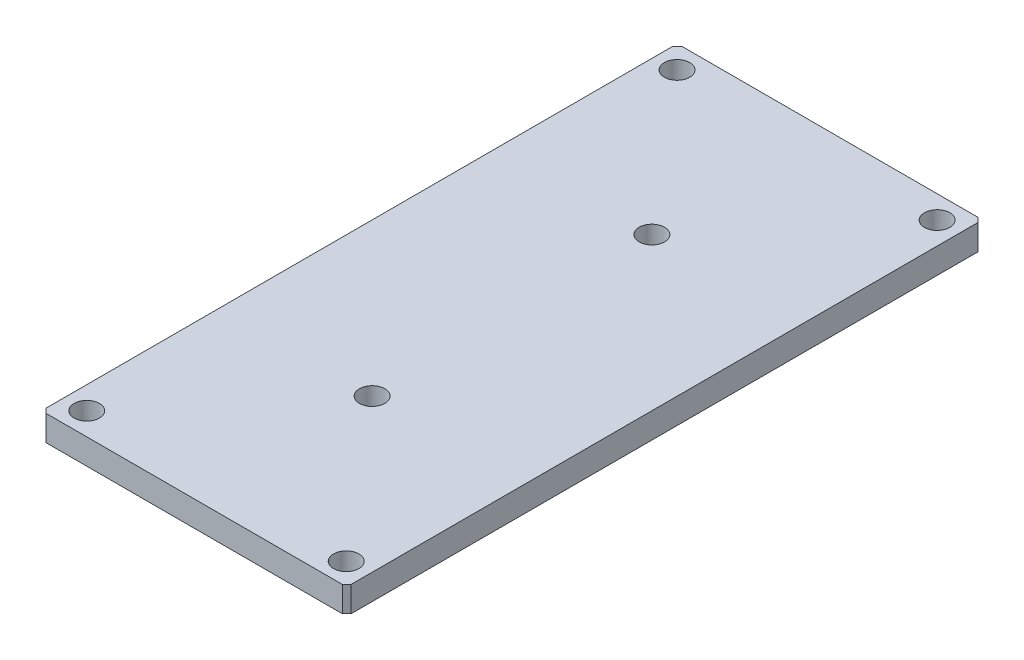
ISO-10303-21;
HEADER;
FILE_DESCRIPTION(('STEP AP214'),'2;1');
FILE_NAME('part.step','',(''),(''),'','','');
FILE_SCHEMA(('AUTOMOTIVE_DESIGN { 1 0 10303 214 1 1 1 1 }'));
ENDSEC;
DATA;
#1=APPLICATION_CONTEXT('core data for automotive mechanical design processes');
#2=APPLICATION_PROTOCOL_DEFINITION('international standard','automotive_design',2000,#1);
#3=PRODUCT_CONTEXT('',#1,'mechanical');
#4=PRODUCT('Part','Part','',(#3));
#5=PRODUCT_RELATED_PRODUCT_CATEGORY('part','',(#4));
#6=PRODUCT_DEFINITION_FORMATION('','',#4);
#7=PRODUCT_DEFINITION_CONTEXT('part definition',#1,'design');
#8=PRODUCT_DEFINITION('design','',#6,#7);
#9=PRODUCT_DEFINITION_SHAPE('','',#8);
#10=(LENGTH_UNIT() NAMED_UNIT(*) SI_UNIT(.MILLI.,.METRE.));
#11=(NAMED_UNIT(*) PLANE_ANGLE_UNIT() SI_UNIT($,.RADIAN.));
#12=(NAMED_UNIT(*) SI_UNIT($,.STERADIAN.) SOLID_ANGLE_UNIT());
#13=UNCERTAINTY_MEASURE_WITH_UNIT(LENGTH_MEASURE(1.E-05),#10,'distance_accuracy_value','');
#14=(GEOMETRIC_REPRESENTATION_CONTEXT(3) GLOBAL_UNCERTAINTY_ASSIGNED_CONTEXT((#13)) GLOBAL_UNIT_ASSIGNED_CONTEXT((#10,
#11,#12)) REPRESENTATION_CONTEXT('',''));
#15=CARTESIAN_POINT('',(0.,0.,0.));
#16=DIRECTION('',(0.,0.,1.));
#17=DIRECTION('',(1.,0.,0.));
#18=AXIS2_PLACEMENT_3D('',#15,#16,#17);
#19=CARTESIAN_POINT('',(0.,2.,0.));
#20=DIRECTION('',(0.,1.,0.));
#21=DIRECTION('',(0.,0.,1.));
#22=AXIS2_PLACEMENT_3D('',#19,#20,#21);
#23=PLANE('',#22);
#24=DIRECTION('',(-0.707106781186537,0.,-0.707106781186558));
#25=VECTOR('',#24,1.);
#26=CARTESIAN_POINT('',(-23.8858439569682,2.,-24.5586256320623));
#27=LINE('',#26,#25);
#28=CARTESIAN_POINT('',(-23.5358439569682,2.,-24.2086256320623));
#29=VERTEX_POINT('',#28);
#30=CARTESIAN_POINT('',(-23.8858439569682,2.,-24.5586256320623));
#31=VERTEX_POINT('',#30);
#32=EDGE_CURVE('E163',#29,#31,#27,.T.);
#33=ORIENTED_EDGE('',*,*,#32,.F.);
#34=DIRECTION('',(1.,0.,0.));
#35=VECTOR('',#34,1.);
#36=CARTESIAN_POINT('',(0.114156043031811,2.,-24.2086256320623));
#37=LINE('',#36,#35);
#38=CARTESIAN_POINT('',(-0.235843956968188,2.,-24.2086256320623));
#39=VERTEX_POINT('',#38);
#40=EDGE_CURVE('E11',#29,#39,#37,.T.);
#41=ORIENTED_EDGE('',*,*,#40,.T.);
#42=DIRECTION('',(-0.707106781186548,0.,0.707106781186547));
#43=VECTOR('',#42,1.);
#44=CARTESIAN_POINT('',(0.114156043031811,2.,-24.5586256320623));
#45=LINE('',#44,#43);
#46=CARTESIAN_POINT('',(0.114156043031811,2.,-24.5586256320623));
#47=VERTEX_POINT('',#46);
#48=EDGE_CURVE('E108',#47,#39,#45,.T.);
#49=ORIENTED_EDGE('',*,*,#48,.F.);
#50=DIRECTION('',(0.,0.,-1.));
#51=VECTOR('',#50,1.);
#52=CARTESIAN_POINT('',(0.114156043031811,2.,-24.2086256320623));
#53=LINE('',#52,#51);
#54=CARTESIAN_POINT('',(0.114156043031811,2.,-73.8586256320623));
#55=VERTEX_POINT('',#54);
#56=EDGE_CURVE('E123',#47,#55,#53,.T.);
#57=ORIENTED_EDGE('',*,*,#56,.T.);
#58=DIRECTION('',(0.707106781186544,0.,0.707106781186551));
#59=VECTOR('',#58,1.);
#60=CARTESIAN_POINT('',(-0.235843956968189,2.,-74.2086256320623));
#61=LINE('',#60,#59);
#62=CARTESIAN_POINT('',(-0.235843956968189,2.,-74.2086256320623));
#63=VERTEX_POINT('',#62);
#64=EDGE_CURVE('E243',#63,#55,#61,.T.);
#65=ORIENTED_EDGE('',*,*,#64,.F.);
#66=DIRECTION('',(-1.,0.,0.));
#67=VECTOR('',#66,1.);
#68=CARTESIAN_POINT('',(0.114156043031811,2.,-74.2086256320623));
#69=LINE('',#68,#67);
#70=CARTESIAN_POINT('',(-23.5358439569682,2.,-74.2086256320623));
#71=VERTEX_POINT('',#70);
#72=EDGE_CURVE('E129',#63,#71,#69,.T.);
#73=ORIENTED_EDGE('',*,*,#72,.T.);
#74=DIRECTION('',(0.707106781186544,0.,-0.707106781186551));
#75=VECTOR('',#74,1.);
#76=CARTESIAN_POINT('',(-23.8858439569682,2.,-73.8586256320623));
#77=LINE('',#76,#75);
#78=CARTESIAN_POINT('',(-23.8858439569682,2.,-73.8586256320623));
#79=VERTEX_POINT('',#78);
#80=EDGE_CURVE('E125',#79,#71,#77,.T.);
#81=ORIENTED_EDGE('',*,*,#80,.F.);
#82=DIRECTION('',(0.,0.,1.));
#83=VECTOR('',#82,1.);
#84=CARTESIAN_POINT('',(-23.8858439569682,2.,-24.2086256320623));
#85=LINE('',#84,#83);
#86=EDGE_CURVE('E48',#79,#31,#85,.T.);
#87=ORIENTED_EDGE('',*,*,#86,.T.);
#88=EDGE_LOOP('',(#33,#41,#49,#57,#65,#73,#81,#87));
#89=FACE_BOUND('',#88,.T.);
#90=CARTESIAN_POINT('',(-1.65584395696819,2.,-25.9386256320623));
#91=DIRECTION('',(0.,1.,0.));
#92=DIRECTION('',(0.,0.,1.));
#93=AXIS2_PLACEMENT_3D('',#90,#91,#92);
#94=CIRCLE('',#93,1.);
#95=CARTESIAN_POINT('',(-1.65584395696819,2.,-24.9386256320623));
#96=VERTEX_POINT('',#95);
#97=EDGE_CURVE('E196',#96,#96,#94,.T.);
#98=ORIENTED_EDGE('',*,*,#97,.F.);
#99=EDGE_LOOP('',(#98));
#100=FACE_BOUND('',#99,.T.);
#101=CARTESIAN_POINT('',(-22.1078439569682,2.,-25.9866256320623));
#102=DIRECTION('',(0.,1.,0.));
#103=DIRECTION('',(0.,0.,1.));
#104=AXIS2_PLACEMENT_3D('',#101,#102,#103);
#105=CIRCLE('',#104,1.);
#106=CARTESIAN_POINT('',(-22.1078439569682,2.,-24.9866256320623));
#107=VERTEX_POINT('',#106);
#108=EDGE_CURVE('E190',#107,#107,#105,.T.);
#109=ORIENTED_EDGE('',*,*,#108,.F.);
#110=EDGE_LOOP('',(#109));
#111=FACE_BOUND('',#110,.T.);
#112=CARTESIAN_POINT('',(-1.65584395696819,2.,-72.4126256320623));
#113=DIRECTION('',(0.,1.,0.));
#114=DIRECTION('',(0.,0.,1.));
#115=AXIS2_PLACEMENT_3D('',#112,#113,#114);
#116=CIRCLE('',#115,1.);
#117=CARTESIAN_POINT('',(-1.65584395696819,2.,-71.4126256320623));
#118=VERTEX_POINT('',#117);
#119=EDGE_CURVE('E184',#118,#118,#116,.T.);
#120=ORIENTED_EDGE('',*,*,#119,.F.);
#121=EDGE_LOOP('',(#120));
#122=FACE_BOUND('',#121,.T.);
#123=CARTESIAN_POINT('',(-22.1098439569682,2.,-72.4126256320623));
#124=DIRECTION('',(0.,1.,0.));
#125=DIRECTION('',(0.,0.,1.));
#126=AXIS2_PLACEMENT_3D('',#123,#124,#125);
#127=CIRCLE('',#126,1.);
#128=CARTESIAN_POINT('',(-22.1098439569682,2.,-71.4126256320623));
#129=VERTEX_POINT('',#128);
#130=EDGE_CURVE('E177',#129,#129,#127,.T.);
#131=ORIENTED_EDGE('',*,*,#130,.F.);
#132=EDGE_LOOP('',(#131));
#133=FACE_BOUND('',#132,.T.);
#134=CARTESIAN_POINT('',(-11.8858439569682,2.,-38.2086256320623));
#135=DIRECTION('',(0.,1.,0.));
#136=DIRECTION('',(0.,0.,1.));
#137=AXIS2_PLACEMENT_3D('',#134,#135,#136);
#138=CIRCLE('',#137,1.);
#139=CARTESIAN_POINT('',(-11.8858439569682,2.,-37.2086256320623));
#140=VERTEX_POINT('',#139);
#141=EDGE_CURVE('E180',#140,#140,#138,.T.);
#142=ORIENTED_EDGE('',*,*,#141,.F.);
#143=EDGE_LOOP('',(#142));
#144=FACE_BOUND('',#143,.T.);
#145=CARTESIAN_POINT('',(-11.8858439569682,2.,-60.2086256320623));
#146=DIRECTION('',(0.,1.,0.));
#147=DIRECTION('',(0.,0.,1.));
#148=AXIS2_PLACEMENT_3D('',#145,#146,#147);
#149=CIRCLE('',#148,1.);
#150=CARTESIAN_POINT('',(-11.8858439569682,2.,-59.2086256320623));
#151=VERTEX_POINT('',#150);
#152=EDGE_CURVE('E144',#151,#151,#149,.T.);
#153=ORIENTED_EDGE('',*,*,#152,.F.);
#154=EDGE_LOOP('',(#153));
#155=FACE_BOUND('',#154,.T.);
#156=ADVANCED_FACE('F39',(#89,#100,#111,#122,#133,#144,#155),#23,.T.);
#157=CARTESIAN_POINT('',(0.,0.,0.));
#158=DIRECTION('',(0.,1.,0.));
#159=DIRECTION('',(0.,0.,1.));
#160=AXIS2_PLACEMENT_3D('',#157,#158,#159);
#161=PLANE('',#160);
#162=CARTESIAN_POINT('',(-1.65584395696819,0.,-25.9386256320623));
#163=DIRECTION('',(0.,1.,0.));
#164=DIRECTION('',(0.,0.,1.));
#165=AXIS2_PLACEMENT_3D('',#162,#163,#164);
#166=CIRCLE('',#165,1.);
#167=CARTESIAN_POINT('',(-1.65584395696819,0.,-24.9386256320623));
#168=VERTEX_POINT('',#167);
#169=EDGE_CURVE('E175',#168,#168,#166,.T.);
#170=ORIENTED_EDGE('',*,*,#169,.T.);
#171=EDGE_LOOP('',(#170));
#172=FACE_BOUND('',#171,.T.);
#173=CARTESIAN_POINT('',(-22.1078439569682,0.,-25.9866256320623));
#174=DIRECTION('',(0.,1.,0.));
#175=DIRECTION('',(0.,0.,1.));
#176=AXIS2_PLACEMENT_3D('',#173,#174,#175);
#177=CIRCLE('',#176,1.);
#178=CARTESIAN_POINT('',(-22.1078439569682,0.,-24.9866256320623));
#179=VERTEX_POINT('',#178);
#180=EDGE_CURVE('E193',#179,#179,#177,.T.);
#181=ORIENTED_EDGE('',*,*,#180,.T.);
#182=EDGE_LOOP('',(#181));
#183=FACE_BOUND('',#182,.T.);
#184=CARTESIAN_POINT('',(-1.65584395696819,0.,-72.4126256320623));
#185=DIRECTION('',(0.,1.,0.));
#186=DIRECTION('',(0.,0.,1.));
#187=AXIS2_PLACEMENT_3D('',#184,#185,#186);
#188=CIRCLE('',#187,1.);
#189=CARTESIAN_POINT('',(-1.65584395696819,0.,-71.4126256320623));
#190=VERTEX_POINT('',#189);
#191=EDGE_CURVE('E187',#190,#190,#188,.T.);
#192=ORIENTED_EDGE('',*,*,#191,.T.);
#193=EDGE_LOOP('',(#192));
#194=FACE_BOUND('',#193,.T.);
#195=CARTESIAN_POINT('',(-22.1098439569682,0.,-72.4126256320623));
#196=DIRECTION('',(0.,1.,0.));
#197=DIRECTION('',(0.,0.,1.));
#198=AXIS2_PLACEMENT_3D('',#195,#196,#197);
#199=CIRCLE('',#198,1.);
#200=CARTESIAN_POINT('',(-22.1098439569682,0.,-71.4126256320623));
#201=VERTEX_POINT('',#200);
#202=EDGE_CURVE('E181',#201,#201,#199,.T.);
#203=ORIENTED_EDGE('',*,*,#202,.T.);
#204=EDGE_LOOP('',(#203));
#205=FACE_BOUND('',#204,.T.);
#206=CARTESIAN_POINT('',(-11.8858439569682,0.,-38.2086256320623));
#207=DIRECTION('',(0.,1.,0.));
#208=DIRECTION('',(0.,0.,1.));
#209=AXIS2_PLACEMENT_3D('',#206,#207,#208);
#210=CIRCLE('',#209,1.);
#211=CARTESIAN_POINT('',(-11.8858439569682,0.,-37.2086256320623));
#212=VERTEX_POINT('',#211);
#213=EDGE_CURVE('E201',#212,#212,#210,.T.);
#214=ORIENTED_EDGE('',*,*,#213,.T.);
#215=EDGE_LOOP('',(#214));
#216=FACE_BOUND('',#215,.T.);
#217=DIRECTION('',(1.,0.,0.));
#218=VECTOR('',#217,1.);
#219=CARTESIAN_POINT('',(0.114156043031811,0.,-24.2086256320623));
#220=LINE('',#219,#218);
#221=CARTESIAN_POINT('',(-23.5358439569682,0.,-24.2086256320623));
#222=VERTEX_POINT('',#221);
#223=CARTESIAN_POINT('',(-0.235843956968188,0.,-24.2086256320623));
#224=VERTEX_POINT('',#223);
#225=EDGE_CURVE('E43',#222,#224,#220,.T.);
#226=ORIENTED_EDGE('',*,*,#225,.F.);
#227=DIRECTION('',(-0.707106781186537,0.,-0.707106781186558));
#228=VECTOR('',#227,1.);
#229=CARTESIAN_POINT('',(-23.8858439569682,0.,-24.5586256320623));
#230=LINE('',#229,#228);
#231=CARTESIAN_POINT('',(-23.8858439569682,0.,-24.5586256320623));
#232=VERTEX_POINT('',#231);
#233=EDGE_CURVE('E160',#222,#232,#230,.T.);
#234=ORIENTED_EDGE('',*,*,#233,.T.);
#235=DIRECTION('',(0.,0.,1.));
#236=VECTOR('',#235,1.);
#237=CARTESIAN_POINT('',(-23.8858439569682,0.,-24.2086256320623));
#238=LINE('',#237,#236);
#239=CARTESIAN_POINT('',(-23.8858439569682,0.,-73.8586256320622));
#240=VERTEX_POINT('',#239);
#241=EDGE_CURVE('E134',#240,#232,#238,.T.);
#242=ORIENTED_EDGE('',*,*,#241,.F.);
#243=DIRECTION('',(0.707106781186544,0.,-0.707106781186551));
#244=VECTOR('',#243,1.);
#245=CARTESIAN_POINT('',(-23.8858439569682,0.,-73.8586256320623));
#246=LINE('',#245,#244);
#247=CARTESIAN_POINT('',(-23.5358439569682,0.,-74.2086256320623));
#248=VERTEX_POINT('',#247);
#249=EDGE_CURVE('E64',#240,#248,#246,.T.);
#250=ORIENTED_EDGE('',*,*,#249,.T.);
#251=DIRECTION('',(-1.,0.,0.));
#252=VECTOR('',#251,1.);
#253=CARTESIAN_POINT('',(0.114156043031811,0.,-74.2086256320623));
#254=LINE('',#253,#252);
#255=CARTESIAN_POINT('',(-0.235843956968189,0.,-74.2086256320623));
#256=VERTEX_POINT('',#255);
#257=EDGE_CURVE('E143',#256,#248,#254,.T.);
#258=ORIENTED_EDGE('',*,*,#257,.F.);
#259=DIRECTION('',(0.707106781186544,0.,0.707106781186551));
#260=VECTOR('',#259,1.);
#261=CARTESIAN_POINT('',(-0.235843956968189,0.,-74.2086256320623));
#262=LINE('',#261,#260);
#263=CARTESIAN_POINT('',(0.114156043031811,0.,-73.8586256320623));
#264=VERTEX_POINT('',#263);
#265=EDGE_CURVE('E56',#256,#264,#262,.T.);
#266=ORIENTED_EDGE('',*,*,#265,.T.);
#267=DIRECTION('',(0.,0.,-1.));
#268=VECTOR('',#267,1.);
#269=CARTESIAN_POINT('',(0.114156043031811,0.,-24.2086256320623));
#270=LINE('',#269,#268);
#271=CARTESIAN_POINT('',(0.114156043031811,0.,-24.5586256320623));
#272=VERTEX_POINT('',#271);
#273=EDGE_CURVE('E141',#272,#264,#270,.T.);
#274=ORIENTED_EDGE('',*,*,#273,.F.);
#275=DIRECTION('',(-0.707106781186548,0.,0.707106781186547));
#276=VECTOR('',#275,1.);
#277=CARTESIAN_POINT('',(0.114156043031811,0.,-24.5586256320623));
#278=LINE('',#277,#276);
#279=EDGE_CURVE('E111',#272,#224,#278,.T.);
#280=ORIENTED_EDGE('',*,*,#279,.T.);
#281=EDGE_LOOP('',(#226,#234,#242,#250,#258,#266,#274,#280));
#282=FACE_BOUND('',#281,.T.);
#283=CARTESIAN_POINT('',(-11.8858439569682,0.,-60.2086256320623));
#284=DIRECTION('',(0.,1.,0.));
#285=DIRECTION('',(0.,0.,1.));
#286=AXIS2_PLACEMENT_3D('',#283,#284,#285);
#287=CIRCLE('',#286,1.);
#288=CARTESIAN_POINT('',(-11.8858439569682,0.,-59.2086256320623));
#289=VERTEX_POINT('',#288);
#290=EDGE_CURVE('E136',#289,#289,#287,.T.);
#291=ORIENTED_EDGE('',*,*,#290,.T.);
#292=EDGE_LOOP('',(#291));
#293=FACE_BOUND('',#292,.T.);
#294=ADVANCED_FACE('F157',(#172,#183,#194,#205,#216,#282,#293),#161,.F.);
#295=CARTESIAN_POINT('',(0.114156043031811,2.,-24.2086256320623));
#296=DIRECTION('',(-1.,0.,0.));
#297=DIRECTION('',(0.,0.,1.));
#298=AXIS2_PLACEMENT_3D('',#295,#296,#297);
#299=PLANE('',#298);
#300=ORIENTED_EDGE('',*,*,#273,.T.);
#301=DIRECTION('',(0.,1.,0.));
#302=VECTOR('',#301,1.);
#303=CARTESIAN_POINT('',(0.114156043031811,0.,-73.8586256320623));
#304=LINE('',#303,#302);
#305=EDGE_CURVE('E128',#264,#55,#304,.T.);
#306=ORIENTED_EDGE('',*,*,#305,.T.);
#307=ORIENTED_EDGE('',*,*,#56,.F.);
#308=DIRECTION('',(0.,1.,0.));
#309=VECTOR('',#308,1.);
#310=CARTESIAN_POINT('',(0.114156043031811,0.,-24.5586256320623));
#311=LINE('',#310,#309);
#312=EDGE_CURVE('E105',#272,#47,#311,.T.);
#313=ORIENTED_EDGE('',*,*,#312,.F.);
#314=EDGE_LOOP('',(#300,#306,#307,#313));
#315=FACE_BOUND('',#314,.T.);
#316=ADVANCED_FACE('F41',(#315),#299,.F.);
#317=CARTESIAN_POINT('',(0.114156043031811,2.,-74.2086256320623));
#318=DIRECTION('',(0.,0.,1.));
#319=DIRECTION('',(1.,0.,0.));
#320=AXIS2_PLACEMENT_3D('',#317,#318,#319);
#321=PLANE('',#320);
#322=ORIENTED_EDGE('',*,*,#72,.F.);
#323=DIRECTION('',(0.,1.,0.));
#324=VECTOR('',#323,1.);
#325=CARTESIAN_POINT('',(-0.235843956968189,0.,-74.2086256320623));
#326=LINE('',#325,#324);
#327=EDGE_CURVE('E241',#256,#63,#326,.T.);
#328=ORIENTED_EDGE('',*,*,#327,.F.);
#329=ORIENTED_EDGE('',*,*,#257,.T.);
#330=DIRECTION('',(0.,1.,0.));
#331=VECTOR('',#330,1.);
#332=CARTESIAN_POINT('',(-23.5358439569682,0.,-74.2086256320623));
#333=LINE('',#332,#331);
#334=EDGE_CURVE('E172',#248,#71,#333,.T.);
#335=ORIENTED_EDGE('',*,*,#334,.T.);
#336=EDGE_LOOP('',(#322,#328,#329,#335));
#337=FACE_BOUND('',#336,.T.);
#338=ADVANCED_FACE('F234',(#337),#321,.F.);
#339=CARTESIAN_POINT('',(-23.8858439569682,2.,-24.2086256320623));
#340=DIRECTION('',(1.,0.,0.));
#341=DIRECTION('',(0.,0.,-1.));
#342=AXIS2_PLACEMENT_3D('',#339,#340,#341);
#343=PLANE('',#342);
#344=ORIENTED_EDGE('',*,*,#241,.T.);
#345=DIRECTION('',(0.,1.,0.));
#346=VECTOR('',#345,1.);
#347=CARTESIAN_POINT('',(-23.8858439569682,0.,-24.5586256320623));
#348=LINE('',#347,#346);
#349=EDGE_CURVE('E152',#232,#31,#348,.T.);
#350=ORIENTED_EDGE('',*,*,#349,.T.);
#351=ORIENTED_EDGE('',*,*,#86,.F.);
#352=DIRECTION('',(0.,1.,0.));
#353=VECTOR('',#352,1.);
#354=CARTESIAN_POINT('',(-23.8858439569682,0.,-73.8586256320623));
#355=LINE('',#354,#353);
#356=EDGE_CURVE('E153',#240,#79,#355,.T.);
#357=ORIENTED_EDGE('',*,*,#356,.F.);
#358=EDGE_LOOP('',(#344,#350,#351,#357));
#359=FACE_BOUND('',#358,.T.);
#360=ADVANCED_FACE('F150',(#359),#343,.F.);
#361=CARTESIAN_POINT('',(0.114156043031811,2.,-24.2086256320623));
#362=DIRECTION('',(0.,0.,-1.));
#363=DIRECTION('',(-1.,0.,0.));
#364=AXIS2_PLACEMENT_3D('',#361,#362,#363);
#365=PLANE('',#364);
#366=ORIENTED_EDGE('',*,*,#40,.F.);
#367=DIRECTION('',(0.,1.,0.));
#368=VECTOR('',#367,1.);
#369=CARTESIAN_POINT('',(-23.5358439569682,0.,-24.2086256320623));
#370=LINE('',#369,#368);
#371=EDGE_CURVE('E164',#222,#29,#370,.T.);
#372=ORIENTED_EDGE('',*,*,#371,.F.);
#373=ORIENTED_EDGE('',*,*,#225,.T.);
#374=DIRECTION('',(0.,1.,0.));
#375=VECTOR('',#374,1.);
#376=CARTESIAN_POINT('',(-0.235843956968188,0.,-24.2086256320623));
#377=LINE('',#376,#375);
#378=EDGE_CURVE('E116',#224,#39,#377,.T.);
#379=ORIENTED_EDGE('',*,*,#378,.T.);
#380=EDGE_LOOP('',(#366,#372,#373,#379));
#381=FACE_BOUND('',#380,.T.);
#382=ADVANCED_FACE('F214',(#381),#365,.F.);
#383=CARTESIAN_POINT('',(-11.8858439569682,2.,-60.2086256320623));
#384=DIRECTION('',(0.,-1.,0.));
#385=DIRECTION('',(0.,0.,-1.));
#386=AXIS2_PLACEMENT_3D('',#383,#384,#385);
#387=CYLINDRICAL_SURFACE('',#386,1.);
#388=ORIENTED_EDGE('',*,*,#152,.T.);
#389=EDGE_LOOP('',(#388));
#390=FACE_BOUND('',#389,.T.);
#391=ORIENTED_EDGE('',*,*,#290,.F.);
#392=EDGE_LOOP('',(#391));
#393=FACE_BOUND('',#392,.T.);
#394=ADVANCED_FACE('F211',(#390,#393),#387,.F.);
#395=CARTESIAN_POINT('',(-11.8858439569682,0.,-38.2086256320623));
#396=DIRECTION('',(0.,1.,0.));
#397=DIRECTION('',(0.,0.,1.));
#398=AXIS2_PLACEMENT_3D('',#395,#396,#397);
#399=CYLINDRICAL_SURFACE('',#398,1.);
#400=ORIENTED_EDGE('',*,*,#213,.F.);
#401=EDGE_LOOP('',(#400));
#402=FACE_BOUND('',#401,.T.);
#403=ORIENTED_EDGE('',*,*,#141,.T.);
#404=EDGE_LOOP('',(#403));
#405=FACE_BOUND('',#404,.T.);
#406=ADVANCED_FACE('F213',(#402,#405),#399,.F.);
#407=CARTESIAN_POINT('',(-22.1098439569682,0.,-72.4126256320623));
#408=DIRECTION('',(0.,1.,0.));
#409=DIRECTION('',(0.,0.,1.));
#410=AXIS2_PLACEMENT_3D('',#407,#408,#409);
#411=CYLINDRICAL_SURFACE('',#410,1.);
#412=ORIENTED_EDGE('',*,*,#202,.F.);
#413=EDGE_LOOP('',(#412));
#414=FACE_BOUND('',#413,.T.);
#415=ORIENTED_EDGE('',*,*,#130,.T.);
#416=EDGE_LOOP('',(#415));
#417=FACE_BOUND('',#416,.T.);
#418=ADVANCED_FACE('F220',(#414,#417),#411,.F.);
#419=CARTESIAN_POINT('',(-1.65584395696819,0.,-72.4126256320623));
#420=DIRECTION('',(0.,1.,0.));
#421=DIRECTION('',(0.,0.,1.));
#422=AXIS2_PLACEMENT_3D('',#419,#420,#421);
#423=CYLINDRICAL_SURFACE('',#422,1.);
#424=ORIENTED_EDGE('',*,*,#191,.F.);
#425=EDGE_LOOP('',(#424));
#426=FACE_BOUND('',#425,.T.);
#427=ORIENTED_EDGE('',*,*,#119,.T.);
#428=EDGE_LOOP('',(#427));
#429=FACE_BOUND('',#428,.T.);
#430=ADVANCED_FACE('F266',(#426,#429),#423,.F.);
#431=CARTESIAN_POINT('',(-22.1078439569682,0.,-25.9866256320623));
#432=DIRECTION('',(0.,1.,0.));
#433=DIRECTION('',(0.,0.,1.));
#434=AXIS2_PLACEMENT_3D('',#431,#432,#433);
#435=CYLINDRICAL_SURFACE('',#434,1.);
#436=ORIENTED_EDGE('',*,*,#180,.F.);
#437=EDGE_LOOP('',(#436));
#438=FACE_BOUND('',#437,.T.);
#439=ORIENTED_EDGE('',*,*,#108,.T.);
#440=EDGE_LOOP('',(#439));
#441=FACE_BOUND('',#440,.T.);
#442=ADVANCED_FACE('F270',(#438,#441),#435,.F.);
#443=CARTESIAN_POINT('',(-1.65584395696819,0.,-25.9386256320623));
#444=DIRECTION('',(0.,1.,0.));
#445=DIRECTION('',(0.,0.,1.));
#446=AXIS2_PLACEMENT_3D('',#443,#444,#445);
#447=CYLINDRICAL_SURFACE('',#446,1.);
#448=ORIENTED_EDGE('',*,*,#169,.F.);
#449=EDGE_LOOP('',(#448));
#450=FACE_BOUND('',#449,.T.);
#451=ORIENTED_EDGE('',*,*,#97,.T.);
#452=EDGE_LOOP('',(#451));
#453=FACE_BOUND('',#452,.T.);
#454=ADVANCED_FACE('F260',(#450,#453),#447,.F.);
#455=CARTESIAN_POINT('',(0.114156043031811,0.,-24.5586256320623));
#456=DIRECTION('',(-0.707106781186547,0.,-0.707106781186548));
#457=DIRECTION('',(-0.707106781186548,0.,0.707106781186547));
#458=AXIS2_PLACEMENT_3D('',#455,#456,#457);
#459=PLANE('',#458);
#460=ORIENTED_EDGE('',*,*,#48,.T.);
#461=ORIENTED_EDGE('',*,*,#378,.F.);
#462=ORIENTED_EDGE('',*,*,#279,.F.);
#463=ORIENTED_EDGE('',*,*,#312,.T.);
#464=EDGE_LOOP('',(#460,#461,#462,#463));
#465=FACE_BOUND('',#464,.T.);
#466=ADVANCED_FACE('F107',(#465),#459,.F.);
#467=CARTESIAN_POINT('',(-23.8858439569682,0.,-24.5586256320623));
#468=DIRECTION('',(0.707106781186558,0.,-0.707106781186537));
#469=DIRECTION('',(-0.707106781186537,0.,-0.707106781186558));
#470=AXIS2_PLACEMENT_3D('',#467,#468,#469);
#471=PLANE('',#470);
#472=ORIENTED_EDGE('',*,*,#32,.T.);
#473=ORIENTED_EDGE('',*,*,#349,.F.);
#474=ORIENTED_EDGE('',*,*,#233,.F.);
#475=ORIENTED_EDGE('',*,*,#371,.T.);
#476=EDGE_LOOP('',(#472,#473,#474,#475));
#477=FACE_BOUND('',#476,.T.);
#478=ADVANCED_FACE('F250',(#477),#471,.F.);
#479=CARTESIAN_POINT('',(-23.8858439569682,0.,-73.8586256320623));
#480=DIRECTION('',(0.707106781186551,0.,0.707106781186544));
#481=DIRECTION('',(0.707106781186544,0.,-0.707106781186551));
#482=AXIS2_PLACEMENT_3D('',#479,#480,#481);
#483=PLANE('',#482);
#484=ORIENTED_EDGE('',*,*,#80,.T.);
#485=ORIENTED_EDGE('',*,*,#334,.F.);
#486=ORIENTED_EDGE('',*,*,#249,.F.);
#487=ORIENTED_EDGE('',*,*,#356,.T.);
#488=EDGE_LOOP('',(#484,#485,#486,#487));
#489=FACE_BOUND('',#488,.T.);
#490=ADVANCED_FACE('F252',(#489),#483,.F.);
#491=CARTESIAN_POINT('',(-0.235843956968189,0.,-74.2086256320623));
#492=DIRECTION('',(-0.707106781186551,0.,0.707106781186545));
#493=DIRECTION('',(0.707106781186545,0.,0.707106781186551));
#494=AXIS2_PLACEMENT_3D('',#491,#492,#493);
#495=PLANE('',#494);
#496=ORIENTED_EDGE('',*,*,#64,.T.);
#497=ORIENTED_EDGE('',*,*,#305,.F.);
#498=ORIENTED_EDGE('',*,*,#265,.F.);
#499=ORIENTED_EDGE('',*,*,#327,.T.);
#500=EDGE_LOOP('',(#496,#497,#498,#499));
#501=FACE_BOUND('',#500,.T.);
#502=ADVANCED_FACE('F258',(#501),#495,.F.);
#503=CLOSED_SHELL('',(#156,#294,#316,#338,#360,#382,#394,#406,#418,#430,#442,#454,#466,#478,
#490,#502));
#504=MANIFOLD_SOLID_BREP('B2',#503);
#505=ADVANCED_BREP_SHAPE_REPRESENTATION('',(#18,#504),#14);
#506=SHAPE_DEFINITION_REPRESENTATION(#9,#505);
ENDSEC;
END-ISO-10303-21;
